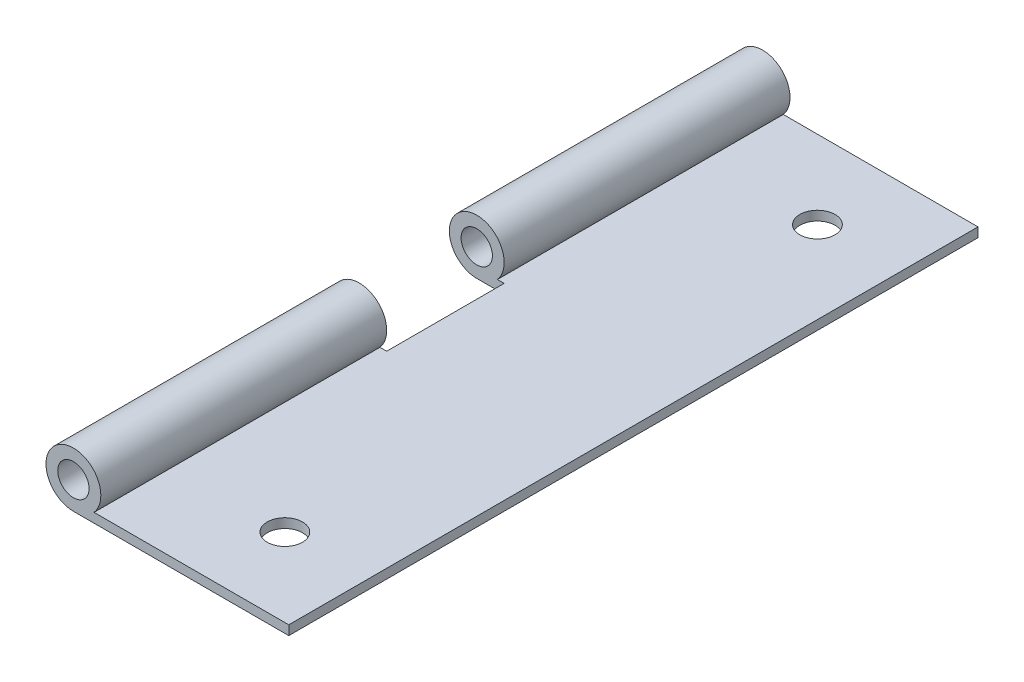
ISO-10303-21;
HEADER;
FILE_DESCRIPTION(('STEP AP214'),'2;1');
FILE_NAME('part.step','',(''),(''),'','','');
FILE_SCHEMA(('AUTOMOTIVE_DESIGN { 1 0 10303 214 1 1 1 1 }'));
ENDSEC;
DATA;
#1=APPLICATION_CONTEXT('core data for automotive mechanical design processes');
#2=APPLICATION_PROTOCOL_DEFINITION('international standard','automotive_design',2000,#1);
#3=PRODUCT_CONTEXT('',#1,'mechanical');
#4=PRODUCT('Part','Part','',(#3));
#5=PRODUCT_RELATED_PRODUCT_CATEGORY('part','',(#4));
#6=PRODUCT_DEFINITION_FORMATION('','',#4);
#7=PRODUCT_DEFINITION_CONTEXT('part definition',#1,'design');
#8=PRODUCT_DEFINITION('design','',#6,#7);
#9=PRODUCT_DEFINITION_SHAPE('','',#8);
#10=(LENGTH_UNIT() NAMED_UNIT(*) SI_UNIT(.MILLI.,.METRE.));
#11=(NAMED_UNIT(*) PLANE_ANGLE_UNIT() SI_UNIT($,.RADIAN.));
#12=(NAMED_UNIT(*) SI_UNIT($,.STERADIAN.) SOLID_ANGLE_UNIT());
#13=UNCERTAINTY_MEASURE_WITH_UNIT(LENGTH_MEASURE(1.E-05),#10,'distance_accuracy_value','');
#14=(GEOMETRIC_REPRESENTATION_CONTEXT(3) GLOBAL_UNCERTAINTY_ASSIGNED_CONTEXT((#13)) GLOBAL_UNIT_ASSIGNED_CONTEXT((#10,
#11,#12)) REPRESENTATION_CONTEXT('',''));
#15=CARTESIAN_POINT('',(0.,0.,0.));
#16=DIRECTION('',(0.,0.,1.));
#17=DIRECTION('',(1.,0.,0.));
#18=AXIS2_PLACEMENT_3D('',#15,#16,#17);
#19=CARTESIAN_POINT('',(-12.,1.2,44.));
#20=DIRECTION('',(1.,0.,0.));
#21=DIRECTION('',(0.,0.,-1.));
#22=AXIS2_PLACEMENT_3D('',#19,#20,#21);
#23=PLANE('',#22);
#24=DIRECTION('',(0.,1.,0.));
#25=VECTOR('',#24,1.);
#26=CARTESIAN_POINT('',(-12.,1.2,-7.5));
#27=LINE('',#26,#25);
#28=CARTESIAN_POINT('',(-12.,0.,-7.5));
#29=VERTEX_POINT('',#28);
#30=CARTESIAN_POINT('',(-12.,1.2,-7.5));
#31=VERTEX_POINT('',#30);
#32=EDGE_CURVE('E48',#29,#31,#27,.T.);
#33=ORIENTED_EDGE('',*,*,#32,.F.);
#34=DIRECTION('',(0.,0.,1.));
#35=VECTOR('',#34,1.);
#36=CARTESIAN_POINT('',(-12.,0.,44.));
#37=LINE('',#36,#35);
#38=CARTESIAN_POINT('',(-12.,0.,7.5));
#39=VERTEX_POINT('',#38);
#40=EDGE_CURVE('E162',#29,#39,#37,.T.);
#41=ORIENTED_EDGE('',*,*,#40,.T.);
#42=DIRECTION('',(0.,1.,0.));
#43=VECTOR('',#42,1.);
#44=CARTESIAN_POINT('',(-12.,1.2,7.5));
#45=LINE('',#44,#43);
#46=CARTESIAN_POINT('',(-12.,1.2,7.5));
#47=VERTEX_POINT('',#46);
#48=EDGE_CURVE('E143',#39,#47,#45,.T.);
#49=ORIENTED_EDGE('',*,*,#48,.T.);
#50=DIRECTION('',(0.,0.,1.));
#51=VECTOR('',#50,1.);
#52=CARTESIAN_POINT('',(-12.,1.2,44.));
#53=LINE('',#52,#51);
#54=EDGE_CURVE('E55',#31,#47,#53,.T.);
#55=ORIENTED_EDGE('',*,*,#54,.F.);
#56=EDGE_LOOP('',(#33,#41,#49,#55));
#57=FACE_BOUND('',#56,.T.);
#58=ADVANCED_FACE('F33',(#57),#23,.F.);
#59=CARTESIAN_POINT('',(12.,1.2,44.));
#60=DIRECTION('',(-1.,0.,0.));
#61=DIRECTION('',(0.,0.,1.));
#62=AXIS2_PLACEMENT_3D('',#59,#60,#61);
#63=PLANE('',#62);
#64=DIRECTION('',(0.,0.,-1.));
#65=VECTOR('',#64,1.);
#66=CARTESIAN_POINT('',(12.,0.,44.));
#67=LINE('',#66,#65);
#68=CARTESIAN_POINT('',(12.,0.,44.));
#69=VERTEX_POINT('',#68);
#70=CARTESIAN_POINT('',(12.,0.,-44.));
#71=VERTEX_POINT('',#70);
#72=EDGE_CURVE('E153',#69,#71,#67,.T.);
#73=ORIENTED_EDGE('',*,*,#72,.T.);
#74=DIRECTION('',(0.,-1.,0.));
#75=VECTOR('',#74,1.);
#76=CARTESIAN_POINT('',(12.,1.2,-44.));
#77=LINE('',#76,#75);
#78=CARTESIAN_POINT('',(12.,1.2,-44.));
#79=VERTEX_POINT('',#78);
#80=EDGE_CURVE('E11',#79,#71,#77,.T.);
#81=ORIENTED_EDGE('',*,*,#80,.F.);
#82=DIRECTION('',(0.,0.,-1.));
#83=VECTOR('',#82,1.);
#84=CARTESIAN_POINT('',(12.,1.2,44.));
#85=LINE('',#84,#83);
#86=CARTESIAN_POINT('',(12.,1.2,44.));
#87=VERTEX_POINT('',#86);
#88=EDGE_CURVE('E103',#87,#79,#85,.T.);
#89=ORIENTED_EDGE('',*,*,#88,.F.);
#90=DIRECTION('',(0.,-1.,0.));
#91=VECTOR('',#90,1.);
#92=CARTESIAN_POINT('',(12.,1.2,44.));
#93=LINE('',#92,#91);
#94=EDGE_CURVE('E41',#87,#69,#93,.T.);
#95=ORIENTED_EDGE('',*,*,#94,.T.);
#96=EDGE_LOOP('',(#73,#81,#89,#95));
#97=FACE_BOUND('',#96,.T.);
#98=ADVANCED_FACE('F35',(#97),#63,.F.);
#99=CARTESIAN_POINT('',(-12.,1.2,-44.));
#100=DIRECTION('',(0.,0.,1.));
#101=DIRECTION('',(1.,0.,0.));
#102=AXIS2_PLACEMENT_3D('',#99,#100,#101);
#103=PLANE('',#102);
#104=DIRECTION('',(-1.,0.,0.));
#105=VECTOR('',#104,1.);
#106=CARTESIAN_POINT('',(-12.,0.,-44.));
#107=LINE('',#106,#105);
#108=CARTESIAN_POINT('',(-15.5,0.,-44.));
#109=VERTEX_POINT('',#108);
#110=EDGE_CURVE('E118',#71,#109,#107,.T.);
#111=ORIENTED_EDGE('',*,*,#110,.T.);
#112=CARTESIAN_POINT('',(-15.5,3.5,-44.));
#113=DIRECTION('',(0.,0.,-1.));
#114=DIRECTION('',(-1.,0.,0.));
#115=AXIS2_PLACEMENT_3D('',#112,#113,#114);
#116=CIRCLE('',#115,3.5);
#117=CARTESIAN_POINT('',(-12.8618188083454,1.2,-44.));
#118=VERTEX_POINT('',#117);
#119=EDGE_CURVE('E112',#109,#118,#116,.T.);
#120=ORIENTED_EDGE('',*,*,#119,.T.);
#121=DIRECTION('',(-1.,0.,0.));
#122=VECTOR('',#121,1.);
#123=CARTESIAN_POINT('',(-12.,1.2,-44.));
#124=LINE('',#123,#122);
#125=EDGE_CURVE('E98',#79,#118,#124,.T.);
#126=ORIENTED_EDGE('',*,*,#125,.F.);
#127=ORIENTED_EDGE('',*,*,#80,.T.);
#128=EDGE_LOOP('',(#111,#120,#126,#127));
#129=FACE_BOUND('',#128,.T.);
#130=CARTESIAN_POINT('',(-15.5,3.5,-44.));
#131=DIRECTION('',(0.,0.,-1.));
#132=DIRECTION('',(-1.,0.,0.));
#133=AXIS2_PLACEMENT_3D('',#130,#131,#132);
#134=CIRCLE('',#133,2.);
#135=CARTESIAN_POINT('',(-17.5,3.5,-44.));
#136=VERTEX_POINT('',#135);
#137=EDGE_CURVE('E126',#136,#136,#134,.T.);
#138=ORIENTED_EDGE('',*,*,#137,.F.);
#139=EDGE_LOOP('',(#138));
#140=FACE_BOUND('',#139,.T.);
#141=ADVANCED_FACE('F116',(#129,#140),#103,.F.);
#142=CARTESIAN_POINT('',(-12.,1.2,44.));
#143=DIRECTION('',(0.,0.,-1.));
#144=DIRECTION('',(-1.,0.,0.));
#145=AXIS2_PLACEMENT_3D('',#142,#143,#144);
#146=PLANE('',#145);
#147=ORIENTED_EDGE('',*,*,#94,.F.);
#148=DIRECTION('',(1.,0.,0.));
#149=VECTOR('',#148,1.);
#150=CARTESIAN_POINT('',(-12.,1.2,44.));
#151=LINE('',#150,#149);
#152=CARTESIAN_POINT('',(-12.8618188083454,1.2,44.));
#153=VERTEX_POINT('',#152);
#154=EDGE_CURVE('E157',#153,#87,#151,.T.);
#155=ORIENTED_EDGE('',*,*,#154,.F.);
#156=CARTESIAN_POINT('',(-15.5,3.5,44.));
#157=DIRECTION('',(0.,0.,-1.));
#158=DIRECTION('',(-1.,0.,0.));
#159=AXIS2_PLACEMENT_3D('',#156,#157,#158);
#160=CIRCLE('',#159,3.5);
#161=CARTESIAN_POINT('',(-15.5,0.,44.));
#162=VERTEX_POINT('',#161);
#163=EDGE_CURVE('E142',#162,#153,#160,.T.);
#164=ORIENTED_EDGE('',*,*,#163,.F.);
#165=DIRECTION('',(1.,0.,0.));
#166=VECTOR('',#165,1.);
#167=CARTESIAN_POINT('',(-12.,0.,44.));
#168=LINE('',#167,#166);
#169=EDGE_CURVE('E154',#162,#69,#168,.T.);
#170=ORIENTED_EDGE('',*,*,#169,.T.);
#171=EDGE_LOOP('',(#147,#155,#164,#170));
#172=FACE_BOUND('',#171,.T.);
#173=CARTESIAN_POINT('',(-15.5,3.5,44.));
#174=DIRECTION('',(0.,0.,-1.));
#175=DIRECTION('',(-1.,0.,0.));
#176=AXIS2_PLACEMENT_3D('',#173,#174,#175);
#177=CIRCLE('',#176,2.);
#178=CARTESIAN_POINT('',(-17.5,3.5,44.));
#179=VERTEX_POINT('',#178);
#180=EDGE_CURVE('E134',#179,#179,#177,.T.);
#181=ORIENTED_EDGE('',*,*,#180,.T.);
#182=EDGE_LOOP('',(#181));
#183=FACE_BOUND('',#182,.T.);
#184=ADVANCED_FACE('F202',(#172,#183),#146,.F.);
#185=CARTESIAN_POINT('',(0.,1.2,0.));
#186=DIRECTION('',(0.,-1.,0.));
#187=DIRECTION('',(0.,0.,-1.));
#188=AXIS2_PLACEMENT_3D('',#185,#186,#187);
#189=PLANE('',#188);
#190=CARTESIAN_POINT('',(1.5,1.2,-34.));
#191=DIRECTION('',(0.,1.,0.));
#192=DIRECTION('',(0.,0.,1.));
#193=AXIS2_PLACEMENT_3D('',#190,#191,#192);
#194=CIRCLE('',#193,2.25);
#195=CARTESIAN_POINT('',(1.5,1.2,-31.75));
#196=VERTEX_POINT('',#195);
#197=EDGE_CURVE('E186',#196,#196,#194,.T.);
#198=ORIENTED_EDGE('',*,*,#197,.F.);
#199=EDGE_LOOP('',(#198));
#200=FACE_BOUND('',#199,.T.);
#201=CARTESIAN_POINT('',(1.5,1.2,34.));
#202=DIRECTION('',(0.,1.,0.));
#203=DIRECTION('',(0.,0.,-1.));
#204=AXIS2_PLACEMENT_3D('',#201,#202,#203);
#205=CIRCLE('',#204,2.25);
#206=CARTESIAN_POINT('',(1.5,1.2,31.75));
#207=VERTEX_POINT('',#206);
#208=EDGE_CURVE('E195',#207,#207,#205,.T.);
#209=ORIENTED_EDGE('',*,*,#208,.F.);
#210=EDGE_LOOP('',(#209));
#211=FACE_BOUND('',#210,.T.);
#212=ORIENTED_EDGE('',*,*,#54,.T.);
#213=DIRECTION('',(-1.,0.,0.));
#214=VECTOR('',#213,1.);
#215=CARTESIAN_POINT('',(-12.,1.2,7.5));
#216=LINE('',#215,#214);
#217=CARTESIAN_POINT('',(-12.8618188083454,1.2,7.5));
#218=VERTEX_POINT('',#217);
#219=EDGE_CURVE('E140',#47,#218,#216,.T.);
#220=ORIENTED_EDGE('',*,*,#219,.T.);
#221=DIRECTION('',(0.,0.,-1.));
#222=VECTOR('',#221,1.);
#223=CARTESIAN_POINT('',(-12.8618188083454,1.2,53.8994949366117));
#224=LINE('',#223,#222);
#225=EDGE_CURVE('E139',#153,#218,#224,.T.);
#226=ORIENTED_EDGE('',*,*,#225,.F.);
#227=ORIENTED_EDGE('',*,*,#154,.T.);
#228=ORIENTED_EDGE('',*,*,#88,.T.);
#229=ORIENTED_EDGE('',*,*,#125,.T.);
#230=DIRECTION('',(0.,0.,1.));
#231=VECTOR('',#230,1.);
#232=CARTESIAN_POINT('',(-12.8618188083454,1.2,-53.8994949366117));
#233=LINE('',#232,#231);
#234=CARTESIAN_POINT('',(-12.8618188083454,1.2,-7.5));
#235=VERTEX_POINT('',#234);
#236=EDGE_CURVE('E101',#118,#235,#233,.T.);
#237=ORIENTED_EDGE('',*,*,#236,.T.);
#238=DIRECTION('',(-1.,0.,0.));
#239=VECTOR('',#238,1.);
#240=CARTESIAN_POINT('',(-12.,1.2,-7.5));
#241=LINE('',#240,#239);
#242=EDGE_CURVE('E120',#31,#235,#241,.T.);
#243=ORIENTED_EDGE('',*,*,#242,.F.);
#244=EDGE_LOOP('',(#212,#220,#226,#227,#228,#229,#237,#243));
#245=FACE_BOUND('',#244,.T.);
#246=ADVANCED_FACE('F100',(#200,#211,#245),#189,.F.);
#247=CARTESIAN_POINT('',(0.,0.,0.));
#248=DIRECTION('',(0.,-1.,0.));
#249=DIRECTION('',(0.,0.,-1.));
#250=AXIS2_PLACEMENT_3D('',#247,#248,#249);
#251=PLANE('',#250);
#252=CARTESIAN_POINT('',(1.5,0.,-34.));
#253=DIRECTION('',(0.,1.,0.));
#254=DIRECTION('',(0.,0.,1.));
#255=AXIS2_PLACEMENT_3D('',#252,#253,#254);
#256=CIRCLE('',#255,2.25);
#257=CARTESIAN_POINT('',(1.5,0.,-31.75));
#258=VERTEX_POINT('',#257);
#259=EDGE_CURVE('E182',#258,#258,#256,.T.);
#260=ORIENTED_EDGE('',*,*,#259,.T.);
#261=EDGE_LOOP('',(#260));
#262=FACE_BOUND('',#261,.T.);
#263=CARTESIAN_POINT('',(1.5,0.,34.));
#264=DIRECTION('',(0.,1.,0.));
#265=DIRECTION('',(0.,0.,-1.));
#266=AXIS2_PLACEMENT_3D('',#263,#264,#265);
#267=CIRCLE('',#266,2.25);
#268=CARTESIAN_POINT('',(1.5,0.,31.75));
#269=VERTEX_POINT('',#268);
#270=EDGE_CURVE('E191',#269,#269,#267,.T.);
#271=ORIENTED_EDGE('',*,*,#270,.T.);
#272=EDGE_LOOP('',(#271));
#273=FACE_BOUND('',#272,.T.);
#274=ORIENTED_EDGE('',*,*,#72,.F.);
#275=ORIENTED_EDGE('',*,*,#169,.F.);
#276=DIRECTION('',(0.,0.,-1.));
#277=VECTOR('',#276,1.);
#278=CARTESIAN_POINT('',(-15.5,0.,53.8994949366117));
#279=LINE('',#278,#277);
#280=CARTESIAN_POINT('',(-15.5,0.,7.5));
#281=VERTEX_POINT('',#280);
#282=EDGE_CURVE('E135',#162,#281,#279,.T.);
#283=ORIENTED_EDGE('',*,*,#282,.T.);
#284=DIRECTION('',(1.,0.,0.));
#285=VECTOR('',#284,1.);
#286=CARTESIAN_POINT('',(-12.,0.,7.5));
#287=LINE('',#286,#285);
#288=EDGE_CURVE('E131',#281,#39,#287,.T.);
#289=ORIENTED_EDGE('',*,*,#288,.T.);
#290=ORIENTED_EDGE('',*,*,#40,.F.);
#291=DIRECTION('',(1.,0.,0.));
#292=VECTOR('',#291,1.);
#293=CARTESIAN_POINT('',(-12.,0.,-7.5));
#294=LINE('',#293,#292);
#295=CARTESIAN_POINT('',(-15.5,0.,-7.5));
#296=VERTEX_POINT('',#295);
#297=EDGE_CURVE('E130',#296,#29,#294,.T.);
#298=ORIENTED_EDGE('',*,*,#297,.F.);
#299=DIRECTION('',(0.,0.,1.));
#300=VECTOR('',#299,1.);
#301=CARTESIAN_POINT('',(-15.5,0.,-53.8994949366117));
#302=LINE('',#301,#300);
#303=EDGE_CURVE('E125',#109,#296,#302,.T.);
#304=ORIENTED_EDGE('',*,*,#303,.F.);
#305=ORIENTED_EDGE('',*,*,#110,.F.);
#306=EDGE_LOOP('',(#274,#275,#283,#289,#290,#298,#304,#305));
#307=FACE_BOUND('',#306,.T.);
#308=ADVANCED_FACE('F170',(#262,#273,#307),#251,.T.);
#309=CARTESIAN_POINT('',(-15.5,3.5,7.5));
#310=DIRECTION('',(0.,0.,1.));
#311=DIRECTION('',(1.,0.,0.));
#312=AXIS2_PLACEMENT_3D('',#309,#310,#311);
#313=PLANE('',#312);
#314=ORIENTED_EDGE('',*,*,#48,.F.);
#315=ORIENTED_EDGE('',*,*,#288,.F.);
#316=CARTESIAN_POINT('',(-15.5,3.5,7.5));
#317=DIRECTION('',(0.,0.,1.));
#318=DIRECTION('',(1.,0.,0.));
#319=AXIS2_PLACEMENT_3D('',#316,#317,#318);
#320=CIRCLE('',#319,3.5);
#321=EDGE_CURVE('E136',#218,#281,#320,.T.);
#322=ORIENTED_EDGE('',*,*,#321,.F.);
#323=ORIENTED_EDGE('',*,*,#219,.F.);
#324=EDGE_LOOP('',(#314,#315,#322,#323));
#325=FACE_BOUND('',#324,.T.);
#326=CARTESIAN_POINT('',(-15.5,3.5,7.5));
#327=DIRECTION('',(0.,0.,1.));
#328=DIRECTION('',(1.,0.,0.));
#329=AXIS2_PLACEMENT_3D('',#326,#327,#328);
#330=CIRCLE('',#329,2.);
#331=CARTESIAN_POINT('',(-13.5,3.5,7.5));
#332=VERTEX_POINT('',#331);
#333=EDGE_CURVE('E129',#332,#332,#330,.T.);
#334=ORIENTED_EDGE('',*,*,#333,.T.);
#335=EDGE_LOOP('',(#334));
#336=FACE_BOUND('',#335,.T.);
#337=ADVANCED_FACE('F209',(#325,#336),#313,.F.);
#338=CARTESIAN_POINT('',(-15.5,3.5,53.8994949366117));
#339=DIRECTION('',(0.,0.,-1.));
#340=DIRECTION('',(-1.,0.,0.));
#341=AXIS2_PLACEMENT_3D('',#338,#339,#340);
#342=CYLINDRICAL_SURFACE('',#341,3.5);
#343=ORIENTED_EDGE('',*,*,#282,.F.);
#344=ORIENTED_EDGE('',*,*,#163,.T.);
#345=ORIENTED_EDGE('',*,*,#225,.T.);
#346=ORIENTED_EDGE('',*,*,#321,.T.);
#347=EDGE_LOOP('',(#343,#344,#345,#346));
#348=FACE_BOUND('',#347,.T.);
#349=ADVANCED_FACE('F298',(#348),#342,.T.);
#350=CARTESIAN_POINT('',(-15.5,3.5,53.8994949366117));
#351=DIRECTION('',(0.,0.,-1.));
#352=DIRECTION('',(-1.,0.,0.));
#353=AXIS2_PLACEMENT_3D('',#350,#351,#352);
#354=CYLINDRICAL_SURFACE('',#353,2.);
#355=ORIENTED_EDGE('',*,*,#180,.F.);
#356=EDGE_LOOP('',(#355));
#357=FACE_BOUND('',#356,.T.);
#358=ORIENTED_EDGE('',*,*,#333,.F.);
#359=EDGE_LOOP('',(#358));
#360=FACE_BOUND('',#359,.T.);
#361=ADVANCED_FACE('F240',(#357,#360),#354,.F.);
#362=CARTESIAN_POINT('',(-15.5,3.5,-7.5));
#363=DIRECTION('',(0.,0.,-1.));
#364=DIRECTION('',(1.,0.,0.));
#365=AXIS2_PLACEMENT_3D('',#362,#363,#364);
#366=PLANE('',#365);
#367=ORIENTED_EDGE('',*,*,#32,.T.);
#368=ORIENTED_EDGE('',*,*,#242,.T.);
#369=CARTESIAN_POINT('',(-15.5,3.5,-7.5));
#370=DIRECTION('',(0.,0.,1.));
#371=DIRECTION('',(1.,0.,0.));
#372=AXIS2_PLACEMENT_3D('',#369,#370,#371);
#373=CIRCLE('',#372,3.5);
#374=EDGE_CURVE('E113',#235,#296,#373,.T.);
#375=ORIENTED_EDGE('',*,*,#374,.T.);
#376=ORIENTED_EDGE('',*,*,#297,.T.);
#377=EDGE_LOOP('',(#367,#368,#375,#376));
#378=FACE_BOUND('',#377,.T.);
#379=CARTESIAN_POINT('',(-15.5,3.5,-7.5));
#380=DIRECTION('',(0.,0.,1.));
#381=DIRECTION('',(1.,0.,0.));
#382=AXIS2_PLACEMENT_3D('',#379,#380,#381);
#383=CIRCLE('',#382,2.);
#384=CARTESIAN_POINT('',(-13.5,3.5,-7.5));
#385=VERTEX_POINT('',#384);
#386=EDGE_CURVE('E180',#385,#385,#383,.T.);
#387=ORIENTED_EDGE('',*,*,#386,.F.);
#388=EDGE_LOOP('',(#387));
#389=FACE_BOUND('',#388,.T.);
#390=ADVANCED_FACE('F235',(#378,#389),#366,.F.);
#391=CARTESIAN_POINT('',(-15.5,3.5,-53.8994949366117));
#392=DIRECTION('',(0.,0.,1.));
#393=DIRECTION('',(-1.,0.,0.));
#394=AXIS2_PLACEMENT_3D('',#391,#392,#393);
#395=CYLINDRICAL_SURFACE('',#394,3.5);
#396=ORIENTED_EDGE('',*,*,#303,.T.);
#397=ORIENTED_EDGE('',*,*,#374,.F.);
#398=ORIENTED_EDGE('',*,*,#236,.F.);
#399=ORIENTED_EDGE('',*,*,#119,.F.);
#400=EDGE_LOOP('',(#396,#397,#398,#399));
#401=FACE_BOUND('',#400,.T.);
#402=ADVANCED_FACE('F111',(#401),#395,.T.);
#403=CARTESIAN_POINT('',(-15.5,3.5,-53.8994949366117));
#404=DIRECTION('',(0.,0.,1.));
#405=DIRECTION('',(-1.,0.,0.));
#406=AXIS2_PLACEMENT_3D('',#403,#404,#405);
#407=CYLINDRICAL_SURFACE('',#406,2.);
#408=ORIENTED_EDGE('',*,*,#137,.T.);
#409=EDGE_LOOP('',(#408));
#410=FACE_BOUND('',#409,.T.);
#411=ORIENTED_EDGE('',*,*,#386,.T.);
#412=EDGE_LOOP('',(#411));
#413=FACE_BOUND('',#412,.T.);
#414=ADVANCED_FACE('F251',(#410,#413),#407,.F.);
#415=CARTESIAN_POINT('',(1.5,0.,34.));
#416=DIRECTION('',(0.,1.,0.));
#417=DIRECTION('',(0.,0.,1.));
#418=AXIS2_PLACEMENT_3D('',#415,#416,#417);
#419=CYLINDRICAL_SURFACE('',#418,2.25);
#420=ORIENTED_EDGE('',*,*,#270,.F.);
#421=EDGE_LOOP('',(#420));
#422=FACE_BOUND('',#421,.T.);
#423=ORIENTED_EDGE('',*,*,#208,.T.);
#424=EDGE_LOOP('',(#423));
#425=FACE_BOUND('',#424,.T.);
#426=ADVANCED_FACE('F199',(#422,#425),#419,.F.);
#427=CARTESIAN_POINT('',(1.5,0.,-34.));
#428=DIRECTION('',(0.,1.,0.));
#429=DIRECTION('',(0.,0.,1.));
#430=AXIS2_PLACEMENT_3D('',#427,#428,#429);
#431=CYLINDRICAL_SURFACE('',#430,2.25);
#432=ORIENTED_EDGE('',*,*,#259,.F.);
#433=EDGE_LOOP('',(#432));
#434=FACE_BOUND('',#433,.T.);
#435=ORIENTED_EDGE('',*,*,#197,.T.);
#436=EDGE_LOOP('',(#435));
#437=FACE_BOUND('',#436,.T.);
#438=ADVANCED_FACE('F281',(#434,#437),#431,.F.);
#439=CLOSED_SHELL('',(#58,#98,#141,#184,#246,#308,#337,#349,#361,#390,#402,#414,#426,#438));
#440=MANIFOLD_SOLID_BREP('B2',#439);
#441=ADVANCED_BREP_SHAPE_REPRESENTATION('',(#18,#440),#14);
#442=SHAPE_DEFINITION_REPRESENTATION(#9,#441);
ENDSEC;
END-ISO-10303-21;
